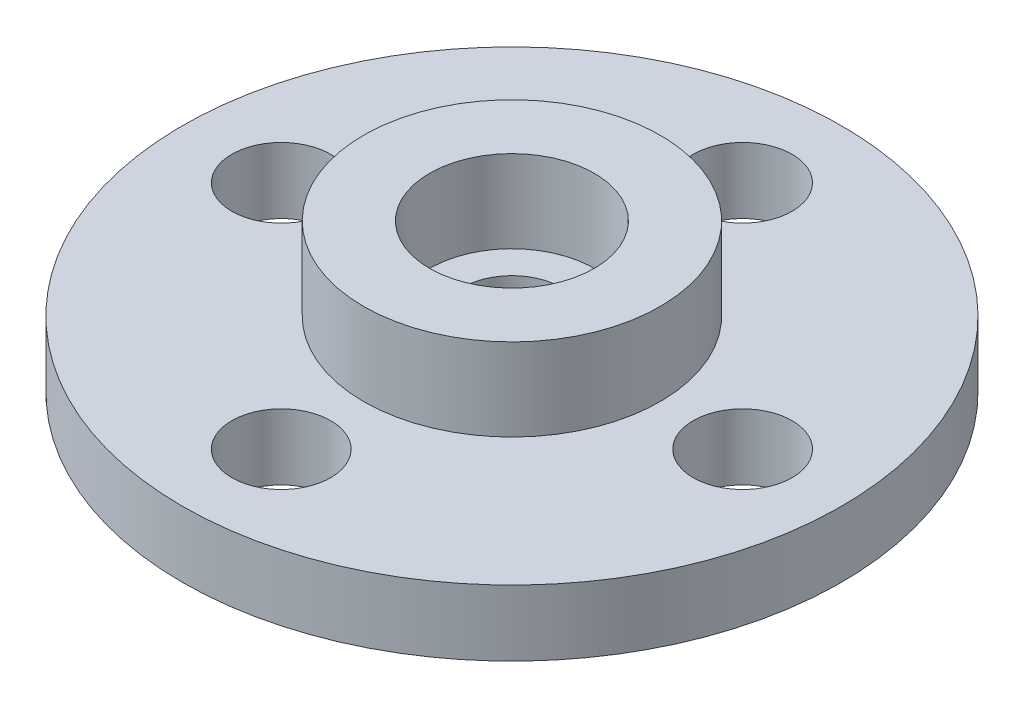
ISO-10303-21;
HEADER;
FILE_DESCRIPTION(('STEP AP214'),'2;1');
FILE_NAME('part.step','',(''),(''),'','','');
FILE_SCHEMA(('AUTOMOTIVE_DESIGN { 1 0 10303 214 1 1 1 1 }'));
ENDSEC;
DATA;
#1=APPLICATION_CONTEXT('core data for automotive mechanical design processes');
#2=APPLICATION_PROTOCOL_DEFINITION('international standard','automotive_design',2000,#1);
#3=PRODUCT_CONTEXT('',#1,'mechanical');
#4=PRODUCT('Part','Part','',(#3));
#5=PRODUCT_RELATED_PRODUCT_CATEGORY('part','',(#4));
#6=PRODUCT_DEFINITION_FORMATION('','',#4);
#7=PRODUCT_DEFINITION_CONTEXT('part definition',#1,'design');
#8=PRODUCT_DEFINITION('design','',#6,#7);
#9=PRODUCT_DEFINITION_SHAPE('','',#8);
#10=(LENGTH_UNIT() NAMED_UNIT(*) SI_UNIT(.MILLI.,.METRE.));
#11=(NAMED_UNIT(*) PLANE_ANGLE_UNIT() SI_UNIT($,.RADIAN.));
#12=(NAMED_UNIT(*) SI_UNIT($,.STERADIAN.) SOLID_ANGLE_UNIT());
#13=UNCERTAINTY_MEASURE_WITH_UNIT(LENGTH_MEASURE(1.E-05),#10,'distance_accuracy_value','');
#14=(GEOMETRIC_REPRESENTATION_CONTEXT(3) GLOBAL_UNCERTAINTY_ASSIGNED_CONTEXT((#13)) GLOBAL_UNIT_ASSIGNED_CONTEXT((#10,
#11,#12)) REPRESENTATION_CONTEXT('',''));
#15=CARTESIAN_POINT('',(0.,0.,0.));
#16=DIRECTION('',(0.,0.,1.));
#17=DIRECTION('',(1.,0.,0.));
#18=AXIS2_PLACEMENT_3D('',#15,#16,#17);
#19=CARTESIAN_POINT('',(0.,2.,0.));
#20=DIRECTION('',(0.,1.,0.));
#21=DIRECTION('',(0.,0.,1.));
#22=AXIS2_PLACEMENT_3D('',#19,#20,#21);
#23=PLANE('',#22);
#24=CARTESIAN_POINT('',(0.,2.,0.));
#25=DIRECTION('',(0.,1.,0.));
#26=DIRECTION('',(0.,0.,1.));
#27=AXIS2_PLACEMENT_3D('',#24,#25,#26);
#28=CIRCLE('',#27,1.5);
#29=CARTESIAN_POINT('',(0.,2.,1.5));
#30=VERTEX_POINT('',#29);
#31=EDGE_CURVE('E50',#30,#30,#28,.T.);
#32=ORIENTED_EDGE('',*,*,#31,.F.);
#33=EDGE_LOOP('',(#32));
#34=FACE_BOUND('',#33,.T.);
#35=CARTESIAN_POINT('',(0.,2.,0.));
#36=DIRECTION('',(0.,1.,0.));
#37=DIRECTION('',(0.,0.,1.));
#38=AXIS2_PLACEMENT_3D('',#35,#36,#37);
#39=CIRCLE('',#38,2.5);
#40=CARTESIAN_POINT('',(0.,2.,2.5));
#41=VERTEX_POINT('',#40);
#42=EDGE_CURVE('E10',#41,#41,#39,.F.);
#43=ORIENTED_EDGE('',*,*,#42,.F.);
#44=EDGE_LOOP('',(#43));
#45=FACE_BOUND('',#44,.T.);
#46=ADVANCED_FACE('F32',(#34,#45),#23,.T.);
#47=CARTESIAN_POINT('',(0.,2.,0.));
#48=DIRECTION('',(0.,-1.,0.));
#49=DIRECTION('',(0.,0.,-1.));
#50=AXIS2_PLACEMENT_3D('',#47,#48,#49);
#51=CYLINDRICAL_SURFACE('',#50,10.);
#52=CARTESIAN_POINT('',(0.,2.,0.));
#53=DIRECTION('',(0.,1.,0.));
#54=DIRECTION('',(0.,0.,1.));
#55=AXIS2_PLACEMENT_3D('',#52,#53,#54);
#56=CIRCLE('',#55,10.);
#57=CARTESIAN_POINT('',(0.,2.,10.));
#58=VERTEX_POINT('',#57);
#59=EDGE_CURVE('E39',#58,#58,#56,.T.);
#60=ORIENTED_EDGE('',*,*,#59,.F.);
#61=EDGE_LOOP('',(#60));
#62=FACE_BOUND('',#61,.T.);
#63=CARTESIAN_POINT('',(0.,0.,0.));
#64=DIRECTION('',(0.,1.,0.));
#65=DIRECTION('',(0.,0.,1.));
#66=AXIS2_PLACEMENT_3D('',#63,#64,#65);
#67=CIRCLE('',#66,10.);
#68=CARTESIAN_POINT('',(0.,0.,10.));
#69=VERTEX_POINT('',#68);
#70=EDGE_CURVE('E43',#69,#69,#67,.T.);
#71=ORIENTED_EDGE('',*,*,#70,.T.);
#72=EDGE_LOOP('',(#71));
#73=FACE_BOUND('',#72,.T.);
#74=ADVANCED_FACE('F34',(#62,#73),#51,.T.);
#75=CARTESIAN_POINT('',(0.,2.,0.));
#76=DIRECTION('',(0.,1.,0.));
#77=DIRECTION('',(0.,0.,1.));
#78=AXIS2_PLACEMENT_3D('',#75,#76,#77);
#79=CIRCLE('',#78,4.5);
#80=CARTESIAN_POINT('',(0.,2.,4.5));
#81=VERTEX_POINT('',#80);
#82=EDGE_CURVE('E80',#81,#81,#79,.T.);
#83=ORIENTED_EDGE('',*,*,#82,.F.);
#84=EDGE_LOOP('',(#83));
#85=FACE_BOUND('',#84,.T.);
#86=CARTESIAN_POINT('',(-7.,2.,0.));
#87=DIRECTION('',(0.,1.,0.));
#88=DIRECTION('',(0.,0.,1.));
#89=AXIS2_PLACEMENT_3D('',#86,#87,#88);
#90=CIRCLE('',#89,1.5);
#91=CARTESIAN_POINT('',(-7.,2.,1.5));
#92=VERTEX_POINT('',#91);
#93=EDGE_CURVE('E68',#92,#92,#90,.T.);
#94=ORIENTED_EDGE('',*,*,#93,.F.);
#95=EDGE_LOOP('',(#94));
#96=FACE_BOUND('',#95,.T.);
#97=CARTESIAN_POINT('',(0.,2.,7.));
#98=DIRECTION('',(0.,1.,0.));
#99=DIRECTION('',(0.,0.,1.));
#100=AXIS2_PLACEMENT_3D('',#97,#98,#99);
#101=CIRCLE('',#100,1.5);
#102=CARTESIAN_POINT('',(0.,2.,8.5));
#103=VERTEX_POINT('',#102);
#104=EDGE_CURVE('E75',#103,#103,#101,.T.);
#105=ORIENTED_EDGE('',*,*,#104,.F.);
#106=EDGE_LOOP('',(#105));
#107=FACE_BOUND('',#106,.T.);
#108=CARTESIAN_POINT('',(7.,2.,0.));
#109=DIRECTION('',(0.,1.,0.));
#110=DIRECTION('',(0.,0.,1.));
#111=AXIS2_PLACEMENT_3D('',#108,#109,#110);
#112=CIRCLE('',#111,1.5);
#113=CARTESIAN_POINT('',(7.,2.,1.5));
#114=VERTEX_POINT('',#113);
#115=EDGE_CURVE('E56',#114,#114,#112,.T.);
#116=ORIENTED_EDGE('',*,*,#115,.F.);
#117=EDGE_LOOP('',(#116));
#118=FACE_BOUND('',#117,.T.);
#119=CARTESIAN_POINT('',(0.,2.,-7.));
#120=DIRECTION('',(0.,1.,0.));
#121=DIRECTION('',(0.,0.,1.));
#122=AXIS2_PLACEMENT_3D('',#119,#120,#121);
#123=CIRCLE('',#122,1.5);
#124=CARTESIAN_POINT('',(0.,2.,-5.5));
#125=VERTEX_POINT('',#124);
#126=EDGE_CURVE('E63',#125,#125,#123,.T.);
#127=ORIENTED_EDGE('',*,*,#126,.F.);
#128=EDGE_LOOP('',(#127));
#129=FACE_BOUND('',#128,.T.);
#130=ORIENTED_EDGE('',*,*,#59,.T.);
#131=EDGE_LOOP('',(#130));
#132=FACE_BOUND('',#131,.T.);
#133=ADVANCED_FACE('F110',(#85,#96,#107,#118,#129,#132),#23,.T.);
#134=CARTESIAN_POINT('',(0.,0.,0.));
#135=DIRECTION('',(0.,1.,0.));
#136=DIRECTION('',(0.,0.,1.));
#137=AXIS2_PLACEMENT_3D('',#134,#135,#136);
#138=PLANE('',#137);
#139=CARTESIAN_POINT('',(-7.,0.,0.));
#140=DIRECTION('',(0.,1.,0.));
#141=DIRECTION('',(0.,0.,1.));
#142=AXIS2_PLACEMENT_3D('',#139,#140,#141);
#143=CIRCLE('',#142,1.5);
#144=CARTESIAN_POINT('',(-7.,0.,1.5));
#145=VERTEX_POINT('',#144);
#146=EDGE_CURVE('E71',#145,#145,#143,.T.);
#147=ORIENTED_EDGE('',*,*,#146,.T.);
#148=EDGE_LOOP('',(#147));
#149=FACE_BOUND('',#148,.T.);
#150=CARTESIAN_POINT('',(0.,0.,7.));
#151=DIRECTION('',(0.,1.,0.));
#152=DIRECTION('',(0.,0.,1.));
#153=AXIS2_PLACEMENT_3D('',#150,#151,#152);
#154=CIRCLE('',#153,1.5);
#155=CARTESIAN_POINT('',(0.,0.,8.5));
#156=VERTEX_POINT('',#155);
#157=EDGE_CURVE('E60',#156,#156,#154,.T.);
#158=ORIENTED_EDGE('',*,*,#157,.T.);
#159=EDGE_LOOP('',(#158));
#160=FACE_BOUND('',#159,.T.);
#161=CARTESIAN_POINT('',(7.,0.,0.));
#162=DIRECTION('',(0.,1.,0.));
#163=DIRECTION('',(0.,0.,1.));
#164=AXIS2_PLACEMENT_3D('',#161,#162,#163);
#165=CIRCLE('',#164,1.5);
#166=CARTESIAN_POINT('',(7.,0.,1.5));
#167=VERTEX_POINT('',#166);
#168=EDGE_CURVE('E59',#167,#167,#165,.T.);
#169=ORIENTED_EDGE('',*,*,#168,.T.);
#170=EDGE_LOOP('',(#169));
#171=FACE_BOUND('',#170,.T.);
#172=CARTESIAN_POINT('',(0.,0.,-7.));
#173=DIRECTION('',(0.,1.,0.));
#174=DIRECTION('',(0.,0.,1.));
#175=AXIS2_PLACEMENT_3D('',#172,#173,#174);
#176=CIRCLE('',#175,1.5);
#177=CARTESIAN_POINT('',(0.,0.,-5.5));
#178=VERTEX_POINT('',#177);
#179=EDGE_CURVE('E53',#178,#178,#176,.T.);
#180=ORIENTED_EDGE('',*,*,#179,.T.);
#181=EDGE_LOOP('',(#180));
#182=FACE_BOUND('',#181,.T.);
#183=CARTESIAN_POINT('',(0.,0.,0.));
#184=DIRECTION('',(0.,1.,0.));
#185=DIRECTION('',(0.,0.,1.));
#186=AXIS2_PLACEMENT_3D('',#183,#184,#185);
#187=CIRCLE('',#186,1.5);
#188=CARTESIAN_POINT('',(0.,0.,1.5));
#189=VERTEX_POINT('',#188);
#190=EDGE_CURVE('E48',#189,#189,#187,.T.);
#191=ORIENTED_EDGE('',*,*,#190,.T.);
#192=EDGE_LOOP('',(#191));
#193=FACE_BOUND('',#192,.T.);
#194=ORIENTED_EDGE('',*,*,#70,.F.);
#195=EDGE_LOOP('',(#194));
#196=FACE_BOUND('',#195,.T.);
#197=ADVANCED_FACE('F119',(#149,#160,#171,#182,#193,#196),#138,.F.);
#198=CARTESIAN_POINT('',(0.,0.,0.));
#199=DIRECTION('',(0.,1.,0.));
#200=DIRECTION('',(0.,0.,1.));
#201=AXIS2_PLACEMENT_3D('',#198,#199,#200);
#202=CYLINDRICAL_SURFACE('',#201,1.5);
#203=ORIENTED_EDGE('',*,*,#190,.F.);
#204=EDGE_LOOP('',(#203));
#205=FACE_BOUND('',#204,.T.);
#206=ORIENTED_EDGE('',*,*,#31,.T.);
#207=EDGE_LOOP('',(#206));
#208=FACE_BOUND('',#207,.T.);
#209=ADVANCED_FACE('F124',(#205,#208),#202,.F.);
#210=CARTESIAN_POINT('',(0.,0.,-7.));
#211=DIRECTION('',(0.,1.,0.));
#212=DIRECTION('',(0.,0.,1.));
#213=AXIS2_PLACEMENT_3D('',#210,#211,#212);
#214=CYLINDRICAL_SURFACE('',#213,1.5);
#215=ORIENTED_EDGE('',*,*,#179,.F.);
#216=EDGE_LOOP('',(#215));
#217=FACE_BOUND('',#216,.T.);
#218=ORIENTED_EDGE('',*,*,#126,.T.);
#219=EDGE_LOOP('',(#218));
#220=FACE_BOUND('',#219,.T.);
#221=ADVANCED_FACE('F136',(#217,#220),#214,.F.);
#222=CARTESIAN_POINT('',(7.,0.,0.));
#223=DIRECTION('',(0.,1.,0.));
#224=DIRECTION('',(0.,0.,1.));
#225=AXIS2_PLACEMENT_3D('',#222,#223,#224);
#226=CYLINDRICAL_SURFACE('',#225,1.5);
#227=ORIENTED_EDGE('',*,*,#168,.F.);
#228=EDGE_LOOP('',(#227));
#229=FACE_BOUND('',#228,.T.);
#230=ORIENTED_EDGE('',*,*,#115,.T.);
#231=EDGE_LOOP('',(#230));
#232=FACE_BOUND('',#231,.T.);
#233=ADVANCED_FACE('F138',(#229,#232),#226,.F.);
#234=CARTESIAN_POINT('',(0.,0.,7.));
#235=DIRECTION('',(0.,1.,0.));
#236=DIRECTION('',(0.,0.,1.));
#237=AXIS2_PLACEMENT_3D('',#234,#235,#236);
#238=CYLINDRICAL_SURFACE('',#237,1.5);
#239=ORIENTED_EDGE('',*,*,#157,.F.);
#240=EDGE_LOOP('',(#239));
#241=FACE_BOUND('',#240,.T.);
#242=ORIENTED_EDGE('',*,*,#104,.T.);
#243=EDGE_LOOP('',(#242));
#244=FACE_BOUND('',#243,.T.);
#245=ADVANCED_FACE('F103',(#241,#244),#238,.F.);
#246=CARTESIAN_POINT('',(-7.,0.,0.));
#247=DIRECTION('',(0.,1.,0.));
#248=DIRECTION('',(0.,0.,1.));
#249=AXIS2_PLACEMENT_3D('',#246,#247,#248);
#250=CYLINDRICAL_SURFACE('',#249,1.5);
#251=ORIENTED_EDGE('',*,*,#146,.F.);
#252=EDGE_LOOP('',(#251));
#253=FACE_BOUND('',#252,.T.);
#254=ORIENTED_EDGE('',*,*,#93,.T.);
#255=EDGE_LOOP('',(#254));
#256=FACE_BOUND('',#255,.T.);
#257=ADVANCED_FACE('F94',(#253,#256),#250,.F.);
#258=CARTESIAN_POINT('',(0.,4.5,0.));
#259=DIRECTION('',(0.,1.,0.));
#260=DIRECTION('',(0.,0.,1.));
#261=AXIS2_PLACEMENT_3D('',#258,#259,#260);
#262=PLANE('',#261);
#263=CARTESIAN_POINT('',(0.,4.5,0.));
#264=DIRECTION('',(0.,1.,0.));
#265=DIRECTION('',(0.,0.,1.));
#266=AXIS2_PLACEMENT_3D('',#263,#264,#265);
#267=CIRCLE('',#266,4.5);
#268=CARTESIAN_POINT('',(0.,4.5,4.5));
#269=VERTEX_POINT('',#268);
#270=EDGE_CURVE('E72',#269,#269,#267,.T.);
#271=ORIENTED_EDGE('',*,*,#270,.T.);
#272=EDGE_LOOP('',(#271));
#273=FACE_BOUND('',#272,.T.);
#274=CARTESIAN_POINT('',(0.,4.5,0.));
#275=DIRECTION('',(0.,1.,0.));
#276=DIRECTION('',(0.,0.,1.));
#277=AXIS2_PLACEMENT_3D('',#274,#275,#276);
#278=CIRCLE('',#277,2.5);
#279=CARTESIAN_POINT('',(0.,4.5,2.5));
#280=VERTEX_POINT('',#279);
#281=EDGE_CURVE('E83',#280,#280,#278,.T.);
#282=ORIENTED_EDGE('',*,*,#281,.F.);
#283=EDGE_LOOP('',(#282));
#284=FACE_BOUND('',#283,.T.);
#285=ADVANCED_FACE('F91',(#273,#284),#262,.T.);
#286=CARTESIAN_POINT('',(0.,4.5,0.));
#287=DIRECTION('',(0.,-1.,0.));
#288=DIRECTION('',(0.,0.,-1.));
#289=AXIS2_PLACEMENT_3D('',#286,#287,#288);
#290=CYLINDRICAL_SURFACE('',#289,4.5);
#291=ORIENTED_EDGE('',*,*,#270,.F.);
#292=EDGE_LOOP('',(#291));
#293=FACE_BOUND('',#292,.T.);
#294=ORIENTED_EDGE('',*,*,#82,.T.);
#295=EDGE_LOOP('',(#294));
#296=FACE_BOUND('',#295,.T.);
#297=ADVANCED_FACE('F93',(#293,#296),#290,.T.);
#298=CARTESIAN_POINT('',(0.,4.5,0.));
#299=DIRECTION('',(0.,-1.,0.));
#300=DIRECTION('',(0.,0.,-1.));
#301=AXIS2_PLACEMENT_3D('',#298,#299,#300);
#302=CYLINDRICAL_SURFACE('',#301,2.5);
#303=ORIENTED_EDGE('',*,*,#281,.T.);
#304=EDGE_LOOP('',(#303));
#305=FACE_BOUND('',#304,.T.);
#306=ORIENTED_EDGE('',*,*,#42,.T.);
#307=EDGE_LOOP('',(#306));
#308=FACE_BOUND('',#307,.T.);
#309=ADVANCED_FACE('F89',(#305,#308),#302,.F.);
#310=CLOSED_SHELL('',(#46,#74,#133,#197,#209,#221,#233,#245,#257,#285,#297,#309));
#311=MANIFOLD_SOLID_BREP('B2',#310);
#312=ADVANCED_BREP_SHAPE_REPRESENTATION('',(#18,#311),#14);
#313=SHAPE_DEFINITION_REPRESENTATION(#9,#312);
ENDSEC;
END-ISO-10303-21;
